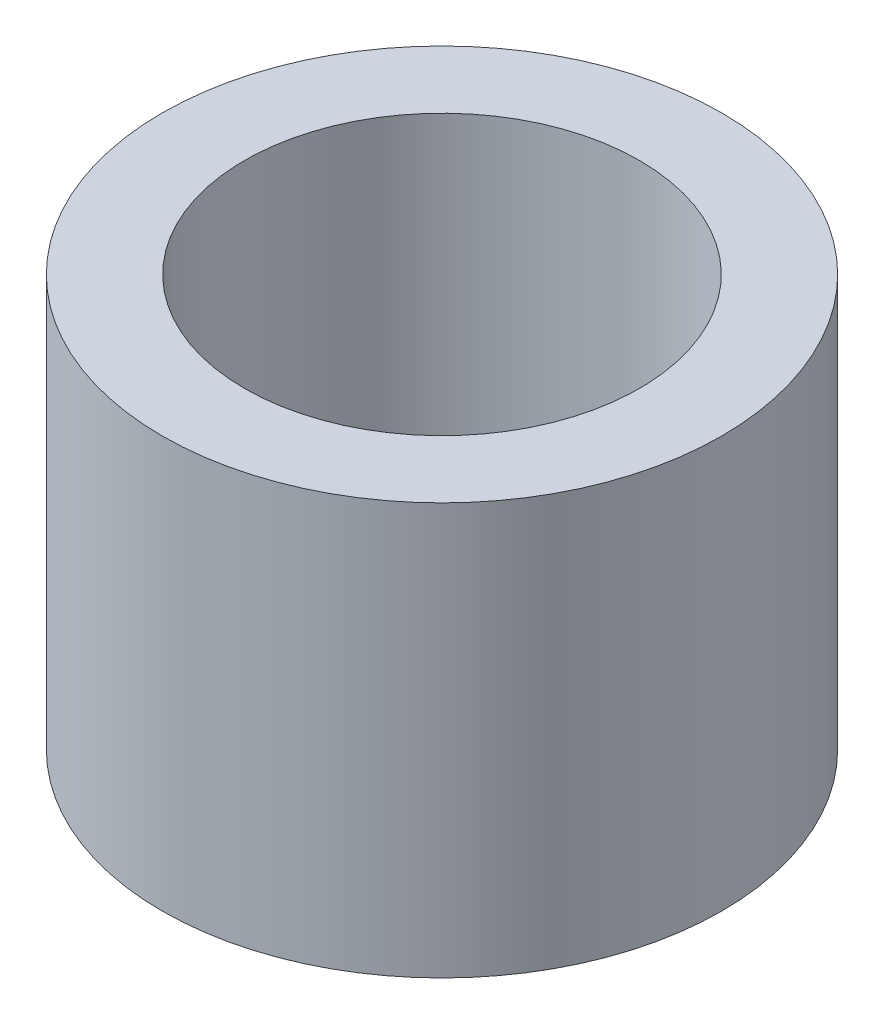
ISO-10303-21;
HEADER;
FILE_DESCRIPTION(('STEP AP214'),'2;1');
FILE_NAME('part.step','',(''),(''),'','','');
FILE_SCHEMA(('AUTOMOTIVE_DESIGN { 1 0 10303 214 1 1 1 1 }'));
ENDSEC;
DATA;
#1=APPLICATION_CONTEXT('core data for automotive mechanical design processes');
#2=APPLICATION_PROTOCOL_DEFINITION('international standard','automotive_design',2000,#1);
#3=PRODUCT_CONTEXT('',#1,'mechanical');
#4=PRODUCT('Part','Part','',(#3));
#5=PRODUCT_RELATED_PRODUCT_CATEGORY('part','',(#4));
#6=PRODUCT_DEFINITION_FORMATION('','',#4);
#7=PRODUCT_DEFINITION_CONTEXT('part definition',#1,'design');
#8=PRODUCT_DEFINITION('design','',#6,#7);
#9=PRODUCT_DEFINITION_SHAPE('','',#8);
#10=(LENGTH_UNIT() NAMED_UNIT(*) SI_UNIT(.MILLI.,.METRE.));
#11=(NAMED_UNIT(*) PLANE_ANGLE_UNIT() SI_UNIT($,.RADIAN.));
#12=(NAMED_UNIT(*) SI_UNIT($,.STERADIAN.) SOLID_ANGLE_UNIT());
#13=UNCERTAINTY_MEASURE_WITH_UNIT(LENGTH_MEASURE(1.E-05),#10,'distance_accuracy_value','');
#14=(GEOMETRIC_REPRESENTATION_CONTEXT(3) GLOBAL_UNCERTAINTY_ASSIGNED_CONTEXT((#13)) GLOBAL_UNIT_ASSIGNED_CONTEXT((#10,
#11,#12)) REPRESENTATION_CONTEXT('',''));
#15=CARTESIAN_POINT('',(0.,0.,0.));
#16=DIRECTION('',(0.,0.,1.));
#17=DIRECTION('',(1.,0.,0.));
#18=AXIS2_PLACEMENT_3D('',#15,#16,#17);
#19=CARTESIAN_POINT('',(0.,12.5,0.));
#20=DIRECTION('',(0.,1.,0.));
#21=DIRECTION('',(0.,0.,1.));
#22=AXIS2_PLACEMENT_3D('',#19,#20,#21);
#23=PLANE('',#22);
#24=CARTESIAN_POINT('',(0.,12.5,0.));
#25=DIRECTION('',(0.,1.,0.));
#26=DIRECTION('',(0.,0.,1.));
#27=AXIS2_PLACEMENT_3D('',#24,#25,#26);
#28=CIRCLE('',#27,17.);
#29=CARTESIAN_POINT('',(0.,12.5,17.));
#30=VERTEX_POINT('',#29);
#31=EDGE_CURVE('E10',#30,#30,#28,.T.);
#32=ORIENTED_EDGE('',*,*,#31,.T.);
#33=EDGE_LOOP('',(#32));
#34=FACE_BOUND('',#33,.T.);
#35=CARTESIAN_POINT('',(0.,12.5,0.));
#36=DIRECTION('',(0.,1.,0.));
#37=DIRECTION('',(0.,0.,1.));
#38=AXIS2_PLACEMENT_3D('',#35,#36,#37);
#39=CIRCLE('',#38,12.);
#40=CARTESIAN_POINT('',(0.,12.5,12.));
#41=VERTEX_POINT('',#40);
#42=EDGE_CURVE('E50',#41,#41,#39,.T.);
#43=ORIENTED_EDGE('',*,*,#42,.F.);
#44=EDGE_LOOP('',(#43));
#45=FACE_BOUND('',#44,.T.);
#46=ADVANCED_FACE('F36',(#34,#45),#23,.T.);
#47=CARTESIAN_POINT('',(0.,-12.5,0.));
#48=DIRECTION('',(0.,1.,0.));
#49=DIRECTION('',(0.,0.,1.));
#50=AXIS2_PLACEMENT_3D('',#47,#48,#49);
#51=PLANE('',#50);
#52=CARTESIAN_POINT('',(0.,-12.5,0.));
#53=DIRECTION('',(0.,1.,0.));
#54=DIRECTION('',(0.,0.,1.));
#55=AXIS2_PLACEMENT_3D('',#52,#53,#54);
#56=CIRCLE('',#55,17.);
#57=CARTESIAN_POINT('',(0.,-12.5,17.));
#58=VERTEX_POINT('',#57);
#59=EDGE_CURVE('E40',#58,#58,#56,.T.);
#60=ORIENTED_EDGE('',*,*,#59,.F.);
#61=EDGE_LOOP('',(#60));
#62=FACE_BOUND('',#61,.T.);
#63=CARTESIAN_POINT('',(0.,-12.5,0.));
#64=DIRECTION('',(0.,1.,0.));
#65=DIRECTION('',(0.,0.,1.));
#66=AXIS2_PLACEMENT_3D('',#63,#64,#65);
#67=CIRCLE('',#66,12.);
#68=CARTESIAN_POINT('',(0.,-12.5,12.));
#69=VERTEX_POINT('',#68);
#70=EDGE_CURVE('E52',#69,#69,#67,.T.);
#71=ORIENTED_EDGE('',*,*,#70,.T.);
#72=EDGE_LOOP('',(#71));
#73=FACE_BOUND('',#72,.T.);
#74=ADVANCED_FACE('F65',(#62,#73),#51,.F.);
#75=CARTESIAN_POINT('',(0.,12.5,0.));
#76=DIRECTION('',(0.,-1.,0.));
#77=DIRECTION('',(0.,0.,-1.));
#78=AXIS2_PLACEMENT_3D('',#75,#76,#77);
#79=CYLINDRICAL_SURFACE('',#78,17.);
#80=ORIENTED_EDGE('',*,*,#31,.F.);
#81=EDGE_LOOP('',(#80));
#82=FACE_BOUND('',#81,.T.);
#83=ORIENTED_EDGE('',*,*,#59,.T.);
#84=EDGE_LOOP('',(#83));
#85=FACE_BOUND('',#84,.T.);
#86=ADVANCED_FACE('F38',(#82,#85),#79,.T.);
#87=CARTESIAN_POINT('',(0.,12.5,0.));
#88=DIRECTION('',(0.,-1.,0.));
#89=DIRECTION('',(0.,0.,-1.));
#90=AXIS2_PLACEMENT_3D('',#87,#88,#89);
#91=CYLINDRICAL_SURFACE('',#90,12.);
#92=ORIENTED_EDGE('',*,*,#42,.T.);
#93=EDGE_LOOP('',(#92));
#94=FACE_BOUND('',#93,.T.);
#95=ORIENTED_EDGE('',*,*,#70,.F.);
#96=EDGE_LOOP('',(#95));
#97=FACE_BOUND('',#96,.T.);
#98=ADVANCED_FACE('F61',(#94,#97),#91,.F.);
#99=CLOSED_SHELL('',(#46,#74,#86,#98));
#100=MANIFOLD_SOLID_BREP('B2',#99);
#101=ADVANCED_BREP_SHAPE_REPRESENTATION('',(#18,#100),#14);
#102=SHAPE_DEFINITION_REPRESENTATION(#9,#101);
ENDSEC;
END-ISO-10303-21;
